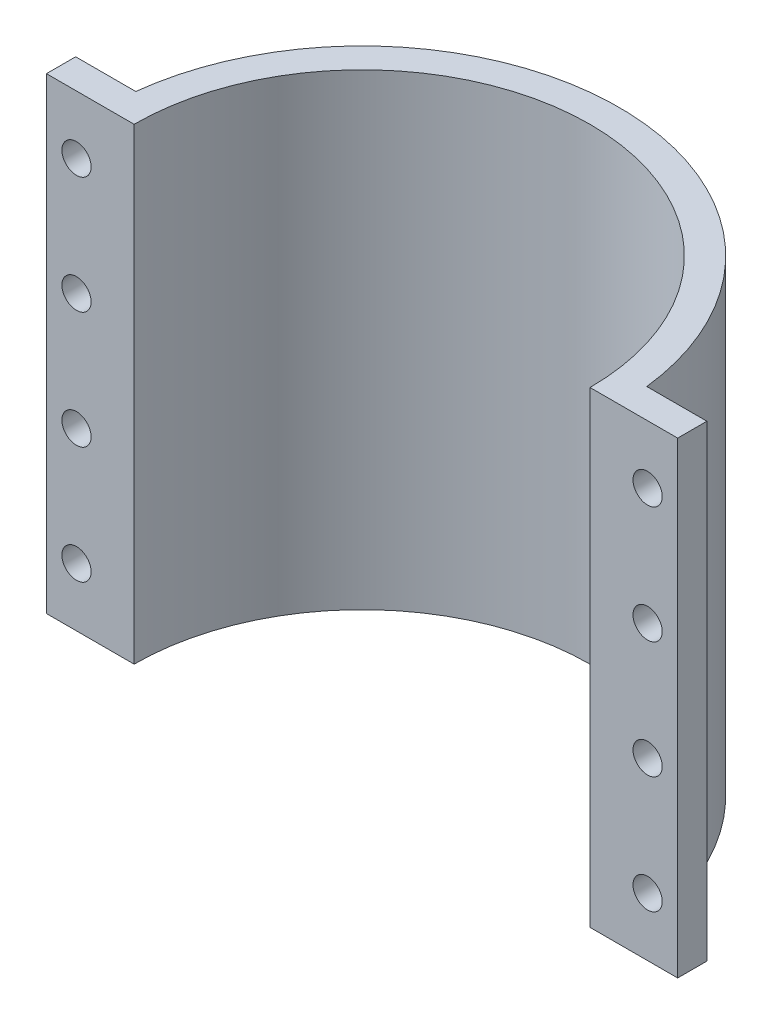
ISO-10303-21;
HEADER;
FILE_DESCRIPTION(('STEP AP214'),'2;1');
FILE_NAME('part.step','',(''),(''),'','','');
FILE_SCHEMA(('AUTOMOTIVE_DESIGN { 1 0 10303 214 1 1 1 1 }'));
ENDSEC;
DATA;
#1=APPLICATION_CONTEXT('core data for automotive mechanical design processes');
#2=APPLICATION_PROTOCOL_DEFINITION('international standard','automotive_design',2000,#1);
#3=PRODUCT_CONTEXT('',#1,'mechanical');
#4=PRODUCT('Part','Part','',(#3));
#5=PRODUCT_RELATED_PRODUCT_CATEGORY('part','',(#4));
#6=PRODUCT_DEFINITION_FORMATION('','',#4);
#7=PRODUCT_DEFINITION_CONTEXT('part definition',#1,'design');
#8=PRODUCT_DEFINITION('design','',#6,#7);
#9=PRODUCT_DEFINITION_SHAPE('','',#8);
#10=(LENGTH_UNIT() NAMED_UNIT(*) SI_UNIT(.MILLI.,.METRE.));
#11=(NAMED_UNIT(*) PLANE_ANGLE_UNIT() SI_UNIT($,.RADIAN.));
#12=(NAMED_UNIT(*) SI_UNIT($,.STERADIAN.) SOLID_ANGLE_UNIT());
#13=UNCERTAINTY_MEASURE_WITH_UNIT(LENGTH_MEASURE(1.E-05),#10,'distance_accuracy_value','');
#14=(GEOMETRIC_REPRESENTATION_CONTEXT(3) GLOBAL_UNCERTAINTY_ASSIGNED_CONTEXT((#13)) GLOBAL_UNIT_ASSIGNED_CONTEXT((#10,
#11,#12)) REPRESENTATION_CONTEXT('',''));
#15=CARTESIAN_POINT('',(0.,0.,0.));
#16=DIRECTION('',(0.,0.,1.));
#17=DIRECTION('',(1.,0.,0.));
#18=AXIS2_PLACEMENT_3D('',#15,#16,#17);
#19=CARTESIAN_POINT('',(0.,101.6,0.));
#20=DIRECTION('',(0.,-1.,0.));
#21=DIRECTION('',(0.,0.,-1.));
#22=AXIS2_PLACEMENT_3D('',#19,#20,#21);
#23=CYLINDRICAL_SURFACE('',#22,55.88);
#24=CARTESIAN_POINT('',(0.,0.,0.));
#25=DIRECTION('',(0.,1.,0.));
#26=DIRECTION('',(0.,0.,1.));
#27=AXIS2_PLACEMENT_3D('',#24,#25,#26);
#28=CIRCLE('',#27,55.88);
#29=CARTESIAN_POINT('',(55.5180322057618,0.,-6.35));
#30=VERTEX_POINT('',#29);
#31=CARTESIAN_POINT('',(-55.5180322057618,0.,-6.35));
#32=VERTEX_POINT('',#31);
#33=EDGE_CURVE('E129',#30,#32,#28,.T.);
#34=ORIENTED_EDGE('',*,*,#33,.T.);
#35=DIRECTION('',(0.,-1.,0.));
#36=VECTOR('',#35,1.);
#37=CARTESIAN_POINT('',(-55.5180322057618,101.6,-6.35));
#38=LINE('',#37,#36);
#39=CARTESIAN_POINT('',(-55.5180322057618,101.6,-6.35));
#40=VERTEX_POINT('',#39);
#41=EDGE_CURVE('E11',#40,#32,#38,.T.);
#42=ORIENTED_EDGE('',*,*,#41,.F.);
#43=CARTESIAN_POINT('',(0.,101.6,0.));
#44=DIRECTION('',(0.,1.,0.));
#45=DIRECTION('',(0.,0.,1.));
#46=AXIS2_PLACEMENT_3D('',#43,#44,#45);
#47=CIRCLE('',#46,55.88);
#48=CARTESIAN_POINT('',(55.5180322057618,101.6,-6.35));
#49=VERTEX_POINT('',#48);
#50=EDGE_CURVE('E144',#49,#40,#47,.T.);
#51=ORIENTED_EDGE('',*,*,#50,.F.);
#52=DIRECTION('',(0.,-1.,0.));
#53=VECTOR('',#52,1.);
#54=CARTESIAN_POINT('',(55.5180322057618,101.6,-6.35));
#55=LINE('',#54,#53);
#56=EDGE_CURVE('E125',#49,#30,#55,.T.);
#57=ORIENTED_EDGE('',*,*,#56,.T.);
#58=EDGE_LOOP('',(#34,#42,#51,#57));
#59=FACE_BOUND('',#58,.T.);
#60=ADVANCED_FACE('F33',(#59),#23,.T.);
#61=CARTESIAN_POINT('',(-55.5180322057618,101.6,-6.35));
#62=DIRECTION('',(0.,0.,1.));
#63=DIRECTION('',(1.,0.,0.));
#64=AXIS2_PLACEMENT_3D('',#61,#62,#63);
#65=PLANE('',#64);
#66=CARTESIAN_POINT('',(-62.0490161028809,63.5,-6.35));
#67=DIRECTION('',(0.,0.,-1.));
#68=DIRECTION('',(-1.,0.,0.));
#69=AXIS2_PLACEMENT_3D('',#66,#67,#68);
#70=CIRCLE('',#69,3.175);
#71=CARTESIAN_POINT('',(-65.2240161028809,63.5,-6.35));
#72=VERTEX_POINT('',#71);
#73=EDGE_CURVE('E202',#72,#72,#70,.T.);
#74=ORIENTED_EDGE('',*,*,#73,.F.);
#75=EDGE_LOOP('',(#74));
#76=FACE_BOUND('',#75,.T.);
#77=CARTESIAN_POINT('',(-62.0490161028809,38.1,-6.35));
#78=DIRECTION('',(0.,0.,-1.));
#79=DIRECTION('',(-1.,0.,0.));
#80=AXIS2_PLACEMENT_3D('',#77,#78,#79);
#81=CIRCLE('',#80,3.17499999999999);
#82=CARTESIAN_POINT('',(-65.2240161028809,38.1,-6.35));
#83=VERTEX_POINT('',#82);
#84=EDGE_CURVE('E196',#83,#83,#81,.T.);
#85=ORIENTED_EDGE('',*,*,#84,.F.);
#86=EDGE_LOOP('',(#85));
#87=FACE_BOUND('',#86,.T.);
#88=CARTESIAN_POINT('',(-62.0490161028809,12.7,-6.35));
#89=DIRECTION('',(0.,0.,-1.));
#90=DIRECTION('',(-1.,0.,0.));
#91=AXIS2_PLACEMENT_3D('',#88,#89,#90);
#92=CIRCLE('',#91,3.175);
#93=CARTESIAN_POINT('',(-65.2240161028809,12.7,-6.35));
#94=VERTEX_POINT('',#93);
#95=EDGE_CURVE('E190',#94,#94,#92,.T.);
#96=ORIENTED_EDGE('',*,*,#95,.F.);
#97=EDGE_LOOP('',(#96));
#98=FACE_BOUND('',#97,.T.);
#99=CARTESIAN_POINT('',(-62.0490161028809,88.9,-6.35));
#100=DIRECTION('',(0.,0.,-1.));
#101=DIRECTION('',(-1.,0.,0.));
#102=AXIS2_PLACEMENT_3D('',#99,#100,#101);
#103=CIRCLE('',#102,3.175);
#104=CARTESIAN_POINT('',(-65.2240161028809,88.9,-6.35));
#105=VERTEX_POINT('',#104);
#106=EDGE_CURVE('E177',#105,#105,#103,.T.);
#107=ORIENTED_EDGE('',*,*,#106,.F.);
#108=EDGE_LOOP('',(#107));
#109=FACE_BOUND('',#108,.T.);
#110=DIRECTION('',(-1.,0.,0.));
#111=VECTOR('',#110,1.);
#112=CARTESIAN_POINT('',(-55.5180322057618,0.,-6.35));
#113=LINE('',#112,#111);
#114=CARTESIAN_POINT('',(-68.58,0.,-6.35));
#115=VERTEX_POINT('',#114);
#116=EDGE_CURVE('E132',#32,#115,#113,.T.);
#117=ORIENTED_EDGE('',*,*,#116,.T.);
#118=DIRECTION('',(0.,-1.,0.));
#119=VECTOR('',#118,1.);
#120=CARTESIAN_POINT('',(-68.58,101.6,-6.35));
#121=LINE('',#120,#119);
#122=CARTESIAN_POINT('',(-68.58,101.6,-6.35));
#123=VERTEX_POINT('',#122);
#124=EDGE_CURVE('E41',#123,#115,#121,.T.);
#125=ORIENTED_EDGE('',*,*,#124,.F.);
#126=DIRECTION('',(-1.,0.,0.));
#127=VECTOR('',#126,1.);
#128=CARTESIAN_POINT('',(-55.5180322057618,101.6,-6.35));
#129=LINE('',#128,#127);
#130=EDGE_CURVE('E92',#40,#123,#129,.T.);
#131=ORIENTED_EDGE('',*,*,#130,.F.);
#132=ORIENTED_EDGE('',*,*,#41,.T.);
#133=EDGE_LOOP('',(#117,#125,#131,#132));
#134=FACE_BOUND('',#133,.T.);
#135=ADVANCED_FACE('F258',(#76,#87,#98,#109,#134),#65,.F.);
#136=CARTESIAN_POINT('',(-68.58,101.6,0.));
#137=DIRECTION('',(1.,0.,0.));
#138=DIRECTION('',(0.,0.,-1.));
#139=AXIS2_PLACEMENT_3D('',#136,#137,#138);
#140=PLANE('',#139);
#141=DIRECTION('',(0.,0.,1.));
#142=VECTOR('',#141,1.);
#143=CARTESIAN_POINT('',(-68.58,0.,0.));
#144=LINE('',#143,#142);
#145=CARTESIAN_POINT('',(-68.58,0.,0.));
#146=VERTEX_POINT('',#145);
#147=EDGE_CURVE('E135',#115,#146,#144,.T.);
#148=ORIENTED_EDGE('',*,*,#147,.T.);
#149=DIRECTION('',(0.,-1.,0.));
#150=VECTOR('',#149,1.);
#151=CARTESIAN_POINT('',(-68.58,101.6,0.));
#152=LINE('',#151,#150);
#153=CARTESIAN_POINT('',(-68.58,101.6,0.));
#154=VERTEX_POINT('',#153);
#155=EDGE_CURVE('E151',#154,#146,#152,.T.);
#156=ORIENTED_EDGE('',*,*,#155,.F.);
#157=DIRECTION('',(0.,0.,1.));
#158=VECTOR('',#157,1.);
#159=CARTESIAN_POINT('',(-68.58,101.6,0.));
#160=LINE('',#159,#158);
#161=EDGE_CURVE('E159',#123,#154,#160,.T.);
#162=ORIENTED_EDGE('',*,*,#161,.F.);
#163=ORIENTED_EDGE('',*,*,#124,.T.);
#164=EDGE_LOOP('',(#148,#156,#162,#163));
#165=FACE_BOUND('',#164,.T.);
#166=ADVANCED_FACE('F157',(#165),#140,.F.);
#167=CARTESIAN_POINT('',(-49.53,101.6,0.));
#168=DIRECTION('',(0.,0.,-1.));
#169=DIRECTION('',(-1.,0.,0.));
#170=AXIS2_PLACEMENT_3D('',#167,#168,#169);
#171=PLANE('',#170);
#172=CARTESIAN_POINT('',(-62.0490161028809,63.5,0.));
#173=DIRECTION('',(0.,0.,-1.));
#174=DIRECTION('',(-1.,0.,0.));
#175=AXIS2_PLACEMENT_3D('',#172,#173,#174);
#176=CIRCLE('',#175,3.175);
#177=CARTESIAN_POINT('',(-65.2240161028809,63.5,0.));
#178=VERTEX_POINT('',#177);
#179=EDGE_CURVE('E180',#178,#178,#176,.T.);
#180=ORIENTED_EDGE('',*,*,#179,.T.);
#181=EDGE_LOOP('',(#180));
#182=FACE_BOUND('',#181,.T.);
#183=CARTESIAN_POINT('',(-62.0490161028809,38.1,0.));
#184=DIRECTION('',(0.,0.,-1.));
#185=DIRECTION('',(-1.,0.,0.));
#186=AXIS2_PLACEMENT_3D('',#183,#184,#185);
#187=CIRCLE('',#186,3.17499999999999);
#188=CARTESIAN_POINT('',(-65.2240161028809,38.1,0.));
#189=VERTEX_POINT('',#188);
#190=EDGE_CURVE('E199',#189,#189,#187,.T.);
#191=ORIENTED_EDGE('',*,*,#190,.T.);
#192=EDGE_LOOP('',(#191));
#193=FACE_BOUND('',#192,.T.);
#194=CARTESIAN_POINT('',(-62.0490161028809,12.7,0.));
#195=DIRECTION('',(0.,0.,-1.));
#196=DIRECTION('',(-1.,0.,0.));
#197=AXIS2_PLACEMENT_3D('',#194,#195,#196);
#198=CIRCLE('',#197,3.175);
#199=CARTESIAN_POINT('',(-65.2240161028809,12.7,0.));
#200=VERTEX_POINT('',#199);
#201=EDGE_CURVE('E193',#200,#200,#198,.T.);
#202=ORIENTED_EDGE('',*,*,#201,.T.);
#203=EDGE_LOOP('',(#202));
#204=FACE_BOUND('',#203,.T.);
#205=CARTESIAN_POINT('',(-62.0490161028809,88.9,0.));
#206=DIRECTION('',(0.,0.,-1.));
#207=DIRECTION('',(-1.,0.,0.));
#208=AXIS2_PLACEMENT_3D('',#205,#206,#207);
#209=CIRCLE('',#208,3.175);
#210=CARTESIAN_POINT('',(-65.2240161028809,88.9,0.));
#211=VERTEX_POINT('',#210);
#212=EDGE_CURVE('E133',#211,#211,#209,.T.);
#213=ORIENTED_EDGE('',*,*,#212,.T.);
#214=EDGE_LOOP('',(#213));
#215=FACE_BOUND('',#214,.T.);
#216=DIRECTION('',(1.,0.,0.));
#217=VECTOR('',#216,1.);
#218=CARTESIAN_POINT('',(-49.53,0.,0.));
#219=LINE('',#218,#217);
#220=CARTESIAN_POINT('',(-49.53,0.,0.));
#221=VERTEX_POINT('',#220);
#222=EDGE_CURVE('E137',#146,#221,#219,.T.);
#223=ORIENTED_EDGE('',*,*,#222,.T.);
#224=DIRECTION('',(0.,-1.,0.));
#225=VECTOR('',#224,1.);
#226=CARTESIAN_POINT('',(-49.53,101.6,0.));
#227=LINE('',#226,#225);
#228=CARTESIAN_POINT('',(-49.53,101.6,0.));
#229=VERTEX_POINT('',#228);
#230=EDGE_CURVE('E148',#229,#221,#227,.T.);
#231=ORIENTED_EDGE('',*,*,#230,.F.);
#232=DIRECTION('',(1.,0.,0.));
#233=VECTOR('',#232,1.);
#234=CARTESIAN_POINT('',(-49.53,101.6,0.));
#235=LINE('',#234,#233);
#236=EDGE_CURVE('E171',#154,#229,#235,.T.);
#237=ORIENTED_EDGE('',*,*,#236,.F.);
#238=ORIENTED_EDGE('',*,*,#155,.T.);
#239=EDGE_LOOP('',(#223,#231,#237,#238));
#240=FACE_BOUND('',#239,.T.);
#241=ADVANCED_FACE('F167',(#182,#193,#204,#215,#240),#171,.F.);
#242=CARTESIAN_POINT('',(0.,101.6,0.));
#243=DIRECTION('',(0.,-1.,0.));
#244=DIRECTION('',(0.,0.,-1.));
#245=AXIS2_PLACEMENT_3D('',#242,#243,#244);
#246=CYLINDRICAL_SURFACE('',#245,49.53);
#247=CARTESIAN_POINT('',(0.,0.,0.));
#248=DIRECTION('',(0.,-1.,0.));
#249=DIRECTION('',(0.,0.,1.));
#250=AXIS2_PLACEMENT_3D('',#247,#248,#249);
#251=CIRCLE('',#250,49.53);
#252=CARTESIAN_POINT('',(49.53,0.,0.));
#253=VERTEX_POINT('',#252);
#254=EDGE_CURVE('E139',#221,#253,#251,.T.);
#255=ORIENTED_EDGE('',*,*,#254,.T.);
#256=DIRECTION('',(0.,-1.,0.));
#257=VECTOR('',#256,1.);
#258=CARTESIAN_POINT('',(49.53,101.6,0.));
#259=LINE('',#258,#257);
#260=CARTESIAN_POINT('',(49.53,101.6,0.));
#261=VERTEX_POINT('',#260);
#262=EDGE_CURVE('E120',#261,#253,#259,.T.);
#263=ORIENTED_EDGE('',*,*,#262,.F.);
#264=CARTESIAN_POINT('',(0.,101.6,0.));
#265=DIRECTION('',(0.,-1.,0.));
#266=DIRECTION('',(0.,0.,1.));
#267=AXIS2_PLACEMENT_3D('',#264,#265,#266);
#268=CIRCLE('',#267,49.53);
#269=EDGE_CURVE('E111',#229,#261,#268,.T.);
#270=ORIENTED_EDGE('',*,*,#269,.F.);
#271=ORIENTED_EDGE('',*,*,#230,.T.);
#272=EDGE_LOOP('',(#255,#263,#270,#271));
#273=FACE_BOUND('',#272,.T.);
#274=ADVANCED_FACE('F170',(#273),#246,.F.);
#275=CARTESIAN_POINT('',(49.53,101.6,0.));
#276=DIRECTION('',(0.,0.,-1.));
#277=DIRECTION('',(-1.,0.,0.));
#278=AXIS2_PLACEMENT_3D('',#275,#276,#277);
#279=PLANE('',#278);
#280=CARTESIAN_POINT('',(62.0490161028809,12.7000000000001,0.));
#281=DIRECTION('',(0.,0.,-1.));
#282=DIRECTION('',(1.,0.,0.));
#283=AXIS2_PLACEMENT_3D('',#280,#281,#282);
#284=CIRCLE('',#283,3.175);
#285=CARTESIAN_POINT('',(65.2240161028809,12.7000000000001,0.));
#286=VERTEX_POINT('',#285);
#287=EDGE_CURVE('E186',#286,#286,#284,.T.);
#288=ORIENTED_EDGE('',*,*,#287,.T.);
#289=EDGE_LOOP('',(#288));
#290=FACE_BOUND('',#289,.T.);
#291=CARTESIAN_POINT('',(62.0490161028809,38.1000000000001,0.));
#292=DIRECTION('',(0.,0.,-1.));
#293=DIRECTION('',(1.,0.,0.));
#294=AXIS2_PLACEMENT_3D('',#291,#292,#293);
#295=CIRCLE('',#294,3.17499999999999);
#296=CARTESIAN_POINT('',(65.2240161028809,38.1000000000001,0.));
#297=VERTEX_POINT('',#296);
#298=EDGE_CURVE('E187',#297,#297,#295,.T.);
#299=ORIENTED_EDGE('',*,*,#298,.T.);
#300=EDGE_LOOP('',(#299));
#301=FACE_BOUND('',#300,.T.);
#302=CARTESIAN_POINT('',(62.0490161028809,63.5,0.));
#303=DIRECTION('',(0.,0.,-1.));
#304=DIRECTION('',(1.,0.,0.));
#305=AXIS2_PLACEMENT_3D('',#302,#303,#304);
#306=CIRCLE('',#305,3.175);
#307=CARTESIAN_POINT('',(65.2240161028809,63.5,0.));
#308=VERTEX_POINT('',#307);
#309=EDGE_CURVE('E216',#308,#308,#306,.T.);
#310=ORIENTED_EDGE('',*,*,#309,.T.);
#311=EDGE_LOOP('',(#310));
#312=FACE_BOUND('',#311,.T.);
#313=CARTESIAN_POINT('',(62.0490161028809,88.9,0.));
#314=DIRECTION('',(0.,0.,-1.));
#315=DIRECTION('',(1.,0.,0.));
#316=AXIS2_PLACEMENT_3D('',#313,#314,#315);
#317=CIRCLE('',#316,3.175);
#318=CARTESIAN_POINT('',(65.2240161028809,88.9,0.));
#319=VERTEX_POINT('',#318);
#320=EDGE_CURVE('E210',#319,#319,#317,.T.);
#321=ORIENTED_EDGE('',*,*,#320,.T.);
#322=EDGE_LOOP('',(#321));
#323=FACE_BOUND('',#322,.T.);
#324=DIRECTION('',(1.,0.,0.));
#325=VECTOR('',#324,1.);
#326=CARTESIAN_POINT('',(49.53,0.,0.));
#327=LINE('',#326,#325);
#328=CARTESIAN_POINT('',(68.58,0.,0.));
#329=VERTEX_POINT('',#328);
#330=EDGE_CURVE('E119',#253,#329,#327,.T.);
#331=ORIENTED_EDGE('',*,*,#330,.T.);
#332=DIRECTION('',(0.,-1.,0.));
#333=VECTOR('',#332,1.);
#334=CARTESIAN_POINT('',(68.58,101.6,0.));
#335=LINE('',#334,#333);
#336=CARTESIAN_POINT('',(68.58,101.6,0.));
#337=VERTEX_POINT('',#336);
#338=EDGE_CURVE('E116',#337,#329,#335,.T.);
#339=ORIENTED_EDGE('',*,*,#338,.F.);
#340=DIRECTION('',(1.,0.,0.));
#341=VECTOR('',#340,1.);
#342=CARTESIAN_POINT('',(49.53,101.6,0.));
#343=LINE('',#342,#341);
#344=EDGE_CURVE('E105',#261,#337,#343,.T.);
#345=ORIENTED_EDGE('',*,*,#344,.F.);
#346=ORIENTED_EDGE('',*,*,#262,.T.);
#347=EDGE_LOOP('',(#331,#339,#345,#346));
#348=FACE_BOUND('',#347,.T.);
#349=ADVANCED_FACE('F117',(#290,#301,#312,#323,#348),#279,.F.);
#350=CARTESIAN_POINT('',(68.58,101.6,0.));
#351=DIRECTION('',(-1.,0.,0.));
#352=DIRECTION('',(0.,0.,1.));
#353=AXIS2_PLACEMENT_3D('',#350,#351,#352);
#354=PLANE('',#353);
#355=DIRECTION('',(0.,0.,-1.));
#356=VECTOR('',#355,1.);
#357=CARTESIAN_POINT('',(68.58,0.,0.));
#358=LINE('',#357,#356);
#359=CARTESIAN_POINT('',(68.58,0.,-6.35));
#360=VERTEX_POINT('',#359);
#361=EDGE_CURVE('E78',#329,#360,#358,.T.);
#362=ORIENTED_EDGE('',*,*,#361,.T.);
#363=DIRECTION('',(0.,-1.,0.));
#364=VECTOR('',#363,1.);
#365=CARTESIAN_POINT('',(68.58,101.6,-6.35));
#366=LINE('',#365,#364);
#367=CARTESIAN_POINT('',(68.58,101.6,-6.35));
#368=VERTEX_POINT('',#367);
#369=EDGE_CURVE('E121',#368,#360,#366,.T.);
#370=ORIENTED_EDGE('',*,*,#369,.F.);
#371=DIRECTION('',(0.,0.,-1.));
#372=VECTOR('',#371,1.);
#373=CARTESIAN_POINT('',(68.58,101.6,0.));
#374=LINE('',#373,#372);
#375=EDGE_CURVE('E109',#337,#368,#374,.T.);
#376=ORIENTED_EDGE('',*,*,#375,.F.);
#377=ORIENTED_EDGE('',*,*,#338,.T.);
#378=EDGE_LOOP('',(#362,#370,#376,#377));
#379=FACE_BOUND('',#378,.T.);
#380=ADVANCED_FACE('F123',(#379),#354,.F.);
#381=CARTESIAN_POINT('',(55.5180322057618,101.6,-6.35));
#382=DIRECTION('',(0.,0.,1.));
#383=DIRECTION('',(1.,0.,0.));
#384=AXIS2_PLACEMENT_3D('',#381,#382,#383);
#385=PLANE('',#384);
#386=CARTESIAN_POINT('',(62.0490161028809,12.7000000000001,-6.35000000000004));
#387=DIRECTION('',(0.,0.,-1.));
#388=DIRECTION('',(1.,0.,0.));
#389=AXIS2_PLACEMENT_3D('',#386,#387,#388);
#390=CIRCLE('',#389,3.175);
#391=CARTESIAN_POINT('',(65.2240161028809,12.7000000000001,-6.35000000000004));
#392=VERTEX_POINT('',#391);
#393=EDGE_CURVE('E183',#392,#392,#390,.T.);
#394=ORIENTED_EDGE('',*,*,#393,.F.);
#395=EDGE_LOOP('',(#394));
#396=FACE_BOUND('',#395,.T.);
#397=CARTESIAN_POINT('',(62.0490161028809,38.1000000000001,-6.35000000000004));
#398=DIRECTION('',(0.,0.,-1.));
#399=DIRECTION('',(1.,0.,0.));
#400=AXIS2_PLACEMENT_3D('',#397,#398,#399);
#401=CIRCLE('',#400,3.17499999999999);
#402=CARTESIAN_POINT('',(65.2240161028809,38.1000000000001,-6.35000000000004));
#403=VERTEX_POINT('',#402);
#404=EDGE_CURVE('E219',#403,#403,#401,.T.);
#405=ORIENTED_EDGE('',*,*,#404,.F.);
#406=EDGE_LOOP('',(#405));
#407=FACE_BOUND('',#406,.T.);
#408=CARTESIAN_POINT('',(62.0490161028809,63.5,-6.35000000000004));
#409=DIRECTION('',(0.,0.,-1.));
#410=DIRECTION('',(1.,0.,0.));
#411=AXIS2_PLACEMENT_3D('',#408,#409,#410);
#412=CIRCLE('',#411,3.175);
#413=CARTESIAN_POINT('',(65.2240161028809,63.5,-6.35000000000004));
#414=VERTEX_POINT('',#413);
#415=EDGE_CURVE('E213',#414,#414,#412,.T.);
#416=ORIENTED_EDGE('',*,*,#415,.F.);
#417=EDGE_LOOP('',(#416));
#418=FACE_BOUND('',#417,.T.);
#419=CARTESIAN_POINT('',(62.0490161028809,88.9,-6.35000000000004));
#420=DIRECTION('',(0.,0.,-1.));
#421=DIRECTION('',(1.,0.,0.));
#422=AXIS2_PLACEMENT_3D('',#419,#420,#421);
#423=CIRCLE('',#422,3.175);
#424=CARTESIAN_POINT('',(65.2240161028809,88.9,-6.35000000000004));
#425=VERTEX_POINT('',#424);
#426=EDGE_CURVE('E207',#425,#425,#423,.T.);
#427=ORIENTED_EDGE('',*,*,#426,.F.);
#428=EDGE_LOOP('',(#427));
#429=FACE_BOUND('',#428,.T.);
#430=DIRECTION('',(-1.,0.,0.));
#431=VECTOR('',#430,1.);
#432=CARTESIAN_POINT('',(55.5180322057618,0.,-6.35));
#433=LINE('',#432,#431);
#434=EDGE_CURVE('E84',#360,#30,#433,.T.);
#435=ORIENTED_EDGE('',*,*,#434,.T.);
#436=ORIENTED_EDGE('',*,*,#56,.F.);
#437=DIRECTION('',(-1.,0.,0.));
#438=VECTOR('',#437,1.);
#439=CARTESIAN_POINT('',(55.5180322057618,101.6,-6.35));
#440=LINE('',#439,#438);
#441=EDGE_CURVE('E49',#368,#49,#440,.T.);
#442=ORIENTED_EDGE('',*,*,#441,.F.);
#443=ORIENTED_EDGE('',*,*,#369,.T.);
#444=EDGE_LOOP('',(#435,#436,#442,#443));
#445=FACE_BOUND('',#444,.T.);
#446=ADVANCED_FACE('F235',(#396,#407,#418,#429,#445),#385,.F.);
#447=CARTESIAN_POINT('',(0.,101.6,0.));
#448=DIRECTION('',(0.,1.,0.));
#449=DIRECTION('',(0.,0.,1.));
#450=AXIS2_PLACEMENT_3D('',#447,#448,#449);
#451=PLANE('',#450);
#452=ORIENTED_EDGE('',*,*,#50,.T.);
#453=ORIENTED_EDGE('',*,*,#130,.T.);
#454=ORIENTED_EDGE('',*,*,#161,.T.);
#455=ORIENTED_EDGE('',*,*,#236,.T.);
#456=ORIENTED_EDGE('',*,*,#269,.T.);
#457=ORIENTED_EDGE('',*,*,#344,.T.);
#458=ORIENTED_EDGE('',*,*,#375,.T.);
#459=ORIENTED_EDGE('',*,*,#441,.T.);
#460=EDGE_LOOP('',(#452,#453,#454,#455,#456,#457,#458,#459));
#461=FACE_BOUND('',#460,.T.);
#462=ADVANCED_FACE('F107',(#461),#451,.T.);
#463=CARTESIAN_POINT('',(0.,0.,0.));
#464=DIRECTION('',(0.,1.,0.));
#465=DIRECTION('',(0.,0.,1.));
#466=AXIS2_PLACEMENT_3D('',#463,#464,#465);
#467=PLANE('',#466);
#468=ORIENTED_EDGE('',*,*,#33,.F.);
#469=ORIENTED_EDGE('',*,*,#434,.F.);
#470=ORIENTED_EDGE('',*,*,#361,.F.);
#471=ORIENTED_EDGE('',*,*,#330,.F.);
#472=ORIENTED_EDGE('',*,*,#254,.F.);
#473=ORIENTED_EDGE('',*,*,#222,.F.);
#474=ORIENTED_EDGE('',*,*,#147,.F.);
#475=ORIENTED_EDGE('',*,*,#116,.F.);
#476=EDGE_LOOP('',(#468,#469,#470,#471,#472,#473,#474,#475));
#477=FACE_BOUND('',#476,.T.);
#478=ADVANCED_FACE('F163',(#477),#467,.F.);
#479=CARTESIAN_POINT('',(62.0490161028809,88.9,0.));
#480=DIRECTION('',(0.,0.,-1.));
#481=DIRECTION('',(-1.,0.,0.));
#482=AXIS2_PLACEMENT_3D('',#479,#480,#481);
#483=CYLINDRICAL_SURFACE('',#482,3.175);
#484=ORIENTED_EDGE('',*,*,#320,.F.);
#485=EDGE_LOOP('',(#484));
#486=FACE_BOUND('',#485,.T.);
#487=ORIENTED_EDGE('',*,*,#426,.T.);
#488=EDGE_LOOP('',(#487));
#489=FACE_BOUND('',#488,.T.);
#490=ADVANCED_FACE('F244',(#486,#489),#483,.F.);
#491=CARTESIAN_POINT('',(62.0490161028809,63.5,0.));
#492=DIRECTION('',(0.,0.,-1.));
#493=DIRECTION('',(-1.,0.,0.));
#494=AXIS2_PLACEMENT_3D('',#491,#492,#493);
#495=CYLINDRICAL_SURFACE('',#494,3.175);
#496=ORIENTED_EDGE('',*,*,#309,.F.);
#497=EDGE_LOOP('',(#496));
#498=FACE_BOUND('',#497,.T.);
#499=ORIENTED_EDGE('',*,*,#415,.T.);
#500=EDGE_LOOP('',(#499));
#501=FACE_BOUND('',#500,.T.);
#502=ADVANCED_FACE('F231',(#498,#501),#495,.F.);
#503=CARTESIAN_POINT('',(62.0490161028809,38.1000000000001,0.));
#504=DIRECTION('',(0.,0.,-1.));
#505=DIRECTION('',(-1.,0.,0.));
#506=AXIS2_PLACEMENT_3D('',#503,#504,#505);
#507=CYLINDRICAL_SURFACE('',#506,3.17499999999999);
#508=ORIENTED_EDGE('',*,*,#298,.F.);
#509=EDGE_LOOP('',(#508));
#510=FACE_BOUND('',#509,.T.);
#511=ORIENTED_EDGE('',*,*,#404,.T.);
#512=EDGE_LOOP('',(#511));
#513=FACE_BOUND('',#512,.T.);
#514=ADVANCED_FACE('F227',(#510,#513),#507,.F.);
#515=CARTESIAN_POINT('',(62.0490161028809,12.7000000000001,0.));
#516=DIRECTION('',(0.,0.,-1.));
#517=DIRECTION('',(-1.,0.,0.));
#518=AXIS2_PLACEMENT_3D('',#515,#516,#517);
#519=CYLINDRICAL_SURFACE('',#518,3.175);
#520=ORIENTED_EDGE('',*,*,#287,.F.);
#521=EDGE_LOOP('',(#520));
#522=FACE_BOUND('',#521,.T.);
#523=ORIENTED_EDGE('',*,*,#393,.T.);
#524=EDGE_LOOP('',(#523));
#525=FACE_BOUND('',#524,.T.);
#526=ADVANCED_FACE('F230',(#522,#525),#519,.F.);
#527=CARTESIAN_POINT('',(-62.0490161028809,88.9,0.));
#528=DIRECTION('',(0.,0.,-1.));
#529=DIRECTION('',(-1.,0.,0.));
#530=AXIS2_PLACEMENT_3D('',#527,#528,#529);
#531=CYLINDRICAL_SURFACE('',#530,3.175);
#532=ORIENTED_EDGE('',*,*,#212,.F.);
#533=EDGE_LOOP('',(#532));
#534=FACE_BOUND('',#533,.T.);
#535=ORIENTED_EDGE('',*,*,#106,.T.);
#536=EDGE_LOOP('',(#535));
#537=FACE_BOUND('',#536,.T.);
#538=ADVANCED_FACE('F285',(#534,#537),#531,.F.);
#539=CARTESIAN_POINT('',(-62.0490161028809,12.7,0.));
#540=DIRECTION('',(0.,0.,-1.));
#541=DIRECTION('',(-1.,0.,0.));
#542=AXIS2_PLACEMENT_3D('',#539,#540,#541);
#543=CYLINDRICAL_SURFACE('',#542,3.175);
#544=ORIENTED_EDGE('',*,*,#201,.F.);
#545=EDGE_LOOP('',(#544));
#546=FACE_BOUND('',#545,.T.);
#547=ORIENTED_EDGE('',*,*,#95,.T.);
#548=EDGE_LOOP('',(#547));
#549=FACE_BOUND('',#548,.T.);
#550=ADVANCED_FACE('F288',(#546,#549),#543,.F.);
#551=CARTESIAN_POINT('',(-62.0490161028809,38.1,0.));
#552=DIRECTION('',(0.,0.,-1.));
#553=DIRECTION('',(-1.,0.,0.));
#554=AXIS2_PLACEMENT_3D('',#551,#552,#553);
#555=CYLINDRICAL_SURFACE('',#554,3.17499999999999);
#556=ORIENTED_EDGE('',*,*,#190,.F.);
#557=EDGE_LOOP('',(#556));
#558=FACE_BOUND('',#557,.T.);
#559=ORIENTED_EDGE('',*,*,#84,.T.);
#560=EDGE_LOOP('',(#559));
#561=FACE_BOUND('',#560,.T.);
#562=ADVANCED_FACE('F295',(#558,#561),#555,.F.);
#563=CARTESIAN_POINT('',(-62.0490161028809,63.5,0.));
#564=DIRECTION('',(0.,0.,-1.));
#565=DIRECTION('',(-1.,0.,0.));
#566=AXIS2_PLACEMENT_3D('',#563,#564,#565);
#567=CYLINDRICAL_SURFACE('',#566,3.175);
#568=ORIENTED_EDGE('',*,*,#179,.F.);
#569=EDGE_LOOP('',(#568));
#570=FACE_BOUND('',#569,.T.);
#571=ORIENTED_EDGE('',*,*,#73,.T.);
#572=EDGE_LOOP('',(#571));
#573=FACE_BOUND('',#572,.T.);
#574=ADVANCED_FACE('F298',(#570,#573),#567,.F.);
#575=CLOSED_SHELL('',(#60,#135,#166,#241,#274,#349,#380,#446,#462,#478,#490,#502,#514,#526,#538,
#550,#562,#574));
#576=MANIFOLD_SOLID_BREP('B2',#575);
#577=ADVANCED_BREP_SHAPE_REPRESENTATION('',(#18,#576),#14);
#578=SHAPE_DEFINITION_REPRESENTATION(#9,#577);
ENDSEC;
END-ISO-10303-21;
